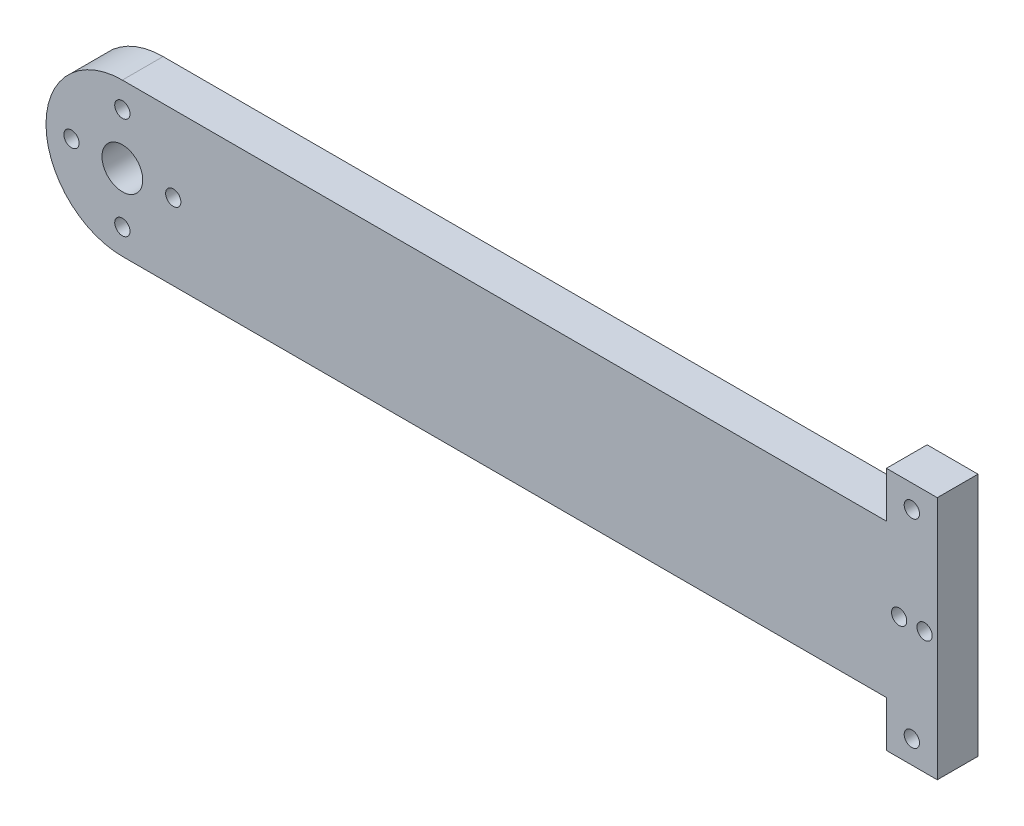
ISO-10303-21;
HEADER;
FILE_DESCRIPTION(('STEP AP214'),'2;1');
FILE_NAME('part.step','',(''),(''),'','','');
FILE_SCHEMA(('AUTOMOTIVE_DESIGN { 1 0 10303 214 1 1 1 1 }'));
ENDSEC;
DATA;
#1=APPLICATION_CONTEXT('core data for automotive mechanical design processes');
#2=APPLICATION_PROTOCOL_DEFINITION('international standard','automotive_design',2000,#1);
#3=PRODUCT_CONTEXT('',#1,'mechanical');
#4=PRODUCT('Part','Part','',(#3));
#5=PRODUCT_RELATED_PRODUCT_CATEGORY('part','',(#4));
#6=PRODUCT_DEFINITION_FORMATION('','',#4);
#7=PRODUCT_DEFINITION_CONTEXT('part definition',#1,'design');
#8=PRODUCT_DEFINITION('design','',#6,#7);
#9=PRODUCT_DEFINITION_SHAPE('','',#8);
#10=(LENGTH_UNIT() NAMED_UNIT(*) SI_UNIT(.MILLI.,.METRE.));
#11=(NAMED_UNIT(*) PLANE_ANGLE_UNIT() SI_UNIT($,.RADIAN.));
#12=(NAMED_UNIT(*) SI_UNIT($,.STERADIAN.) SOLID_ANGLE_UNIT());
#13=UNCERTAINTY_MEASURE_WITH_UNIT(LENGTH_MEASURE(1.E-05),#10,'distance_accuracy_value','');
#14=(GEOMETRIC_REPRESENTATION_CONTEXT(3) GLOBAL_UNCERTAINTY_ASSIGNED_CONTEXT((#13)) GLOBAL_UNIT_ASSIGNED_CONTEXT((#10,
#11,#12)) REPRESENTATION_CONTEXT('',''));
#15=CARTESIAN_POINT('',(0.,0.,0.));
#16=DIRECTION('',(0.,0.,1.));
#17=DIRECTION('',(1.,0.,0.));
#18=AXIS2_PLACEMENT_3D('',#15,#16,#17);
#19=CARTESIAN_POINT('',(0.,-27.2171452130383,8.));
#20=DIRECTION('',(0.,0.,-1.));
#21=DIRECTION('',(-1.,0.,0.));
#22=AXIS2_PLACEMENT_3D('',#19,#20,#21);
#23=CYLINDRICAL_SURFACE('',#22,15.0017483158971);
#24=CARTESIAN_POINT('',(0.,-27.2171452130383,0.));
#25=DIRECTION('',(0.,0.,1.));
#26=DIRECTION('',(1.,0.,0.));
#27=AXIS2_PLACEMENT_3D('',#24,#25,#26);
#28=CIRCLE('',#27,15.0017483158971);
#29=CARTESIAN_POINT('',(0.,-12.2153968971412,0.));
#30=VERTEX_POINT('',#29);
#31=CARTESIAN_POINT('',(0.,-42.2188935289354,0.));
#32=VERTEX_POINT('',#31);
#33=EDGE_CURVE('E141',#30,#32,#28,.T.);
#34=ORIENTED_EDGE('',*,*,#33,.T.);
#35=DIRECTION('',(0.,0.,-1.));
#36=VECTOR('',#35,1.);
#37=CARTESIAN_POINT('',(0.,-42.2188935289354,8.));
#38=LINE('',#37,#36);
#39=CARTESIAN_POINT('',(0.,-42.2188935289354,8.));
#40=VERTEX_POINT('',#39);
#41=EDGE_CURVE('E11',#40,#32,#38,.T.);
#42=ORIENTED_EDGE('',*,*,#41,.F.);
#43=CARTESIAN_POINT('',(0.,-27.2171452130383,8.));
#44=DIRECTION('',(0.,0.,1.));
#45=DIRECTION('',(1.,0.,0.));
#46=AXIS2_PLACEMENT_3D('',#43,#44,#45);
#47=CIRCLE('',#46,15.0017483158971);
#48=CARTESIAN_POINT('',(0.,-12.2153968971412,8.));
#49=VERTEX_POINT('',#48);
#50=EDGE_CURVE('E165',#49,#40,#47,.T.);
#51=ORIENTED_EDGE('',*,*,#50,.F.);
#52=DIRECTION('',(0.,0.,-1.));
#53=VECTOR('',#52,1.);
#54=CARTESIAN_POINT('',(0.,-12.2153968971412,8.));
#55=LINE('',#54,#53);
#56=EDGE_CURVE('E137',#49,#30,#55,.T.);
#57=ORIENTED_EDGE('',*,*,#56,.T.);
#58=EDGE_LOOP('',(#34,#42,#51,#57));
#59=FACE_BOUND('',#58,.T.);
#60=ADVANCED_FACE('F39',(#59),#23,.T.);
#61=CARTESIAN_POINT('',(0.,-42.2188935289354,8.));
#62=DIRECTION('',(0.,1.,0.));
#63=DIRECTION('',(0.,0.,1.));
#64=AXIS2_PLACEMENT_3D('',#61,#62,#63);
#65=PLANE('',#64);
#66=DIRECTION('',(1.,0.,0.));
#67=VECTOR('',#66,1.);
#68=CARTESIAN_POINT('',(0.,-42.2188935289354,0.));
#69=LINE('',#68,#67);
#70=CARTESIAN_POINT('',(150.106998899436,-42.2188935289354,0.));
#71=VERTEX_POINT('',#70);
#72=EDGE_CURVE('E145',#32,#71,#69,.T.);
#73=ORIENTED_EDGE('',*,*,#72,.T.);
#74=DIRECTION('',(0.,0.,-1.));
#75=VECTOR('',#74,1.);
#76=CARTESIAN_POINT('',(150.106998899436,-42.2188935289354,8.));
#77=LINE('',#76,#75);
#78=CARTESIAN_POINT('',(150.106998899436,-42.2188935289354,8.));
#79=VERTEX_POINT('',#78);
#80=EDGE_CURVE('E49',#79,#71,#77,.T.);
#81=ORIENTED_EDGE('',*,*,#80,.F.);
#82=DIRECTION('',(1.,0.,0.));
#83=VECTOR('',#82,1.);
#84=CARTESIAN_POINT('',(0.,-42.2188935289354,8.));
#85=LINE('',#84,#83);
#86=EDGE_CURVE('E101',#40,#79,#85,.T.);
#87=ORIENTED_EDGE('',*,*,#86,.F.);
#88=ORIENTED_EDGE('',*,*,#41,.T.);
#89=EDGE_LOOP('',(#73,#81,#87,#88));
#90=FACE_BOUND('',#89,.T.);
#91=ADVANCED_FACE('F258',(#90),#65,.F.);
#92=CARTESIAN_POINT('',(150.106998899436,-42.2188935289354,8.));
#93=DIRECTION('',(1.,0.,0.));
#94=DIRECTION('',(0.,0.,-1.));
#95=AXIS2_PLACEMENT_3D('',#92,#93,#94);
#96=PLANE('',#95);
#97=DIRECTION('',(0.,-1.,0.));
#98=VECTOR('',#97,1.);
#99=CARTESIAN_POINT('',(150.106998899436,-42.2188935289354,0.));
#100=LINE('',#99,#98);
#101=CARTESIAN_POINT('',(150.106998899436,-51.2231194720718,0.));
#102=VERTEX_POINT('',#101);
#103=EDGE_CURVE('E148',#71,#102,#100,.T.);
#104=ORIENTED_EDGE('',*,*,#103,.T.);
#105=DIRECTION('',(0.,0.,-1.));
#106=VECTOR('',#105,1.);
#107=CARTESIAN_POINT('',(150.106998899436,-51.2231194720718,8.));
#108=LINE('',#107,#106);
#109=CARTESIAN_POINT('',(150.106998899436,-51.2231194720718,8.));
#110=VERTEX_POINT('',#109);
#111=EDGE_CURVE('E176',#110,#102,#108,.T.);
#112=ORIENTED_EDGE('',*,*,#111,.F.);
#113=DIRECTION('',(0.,-1.,0.));
#114=VECTOR('',#113,1.);
#115=CARTESIAN_POINT('',(150.106998899436,-42.2188935289354,8.));
#116=LINE('',#115,#114);
#117=EDGE_CURVE('E421',#79,#110,#116,.T.);
#118=ORIENTED_EDGE('',*,*,#117,.F.);
#119=ORIENTED_EDGE('',*,*,#80,.T.);
#120=EDGE_LOOP('',(#104,#112,#118,#119));
#121=FACE_BOUND('',#120,.T.);
#122=ADVANCED_FACE('F262',(#121),#96,.F.);
#123=CARTESIAN_POINT('',(155.102889250726,-51.2231194720718,8.));
#124=DIRECTION('',(0.,1.,0.));
#125=DIRECTION('',(0.,0.,1.));
#126=AXIS2_PLACEMENT_3D('',#123,#124,#125);
#127=PLANE('',#126);
#128=DIRECTION('',(1.,0.,0.));
#129=VECTOR('',#128,1.);
#130=CARTESIAN_POINT('',(155.102889250726,-51.2231194720718,0.));
#131=LINE('',#130,#129);
#132=CARTESIAN_POINT('',(160.100118241478,-51.2231194720718,0.));
#133=VERTEX_POINT('',#132);
#134=EDGE_CURVE('E152',#102,#133,#131,.T.);
#135=ORIENTED_EDGE('',*,*,#134,.T.);
#136=DIRECTION('',(0.,0.,-1.));
#137=VECTOR('',#136,1.);
#138=CARTESIAN_POINT('',(160.100118241478,-51.2231194720718,8.));
#139=LINE('',#138,#137);
#140=CARTESIAN_POINT('',(160.100118241478,-51.2231194720718,8.));
#141=VERTEX_POINT('',#140);
#142=EDGE_CURVE('E172',#141,#133,#139,.T.);
#143=ORIENTED_EDGE('',*,*,#142,.F.);
#144=DIRECTION('',(1.,0.,0.));
#145=VECTOR('',#144,1.);
#146=CARTESIAN_POINT('',(150.106998899436,-51.2231194720718,8.));
#147=LINE('',#146,#145);
#148=EDGE_CURVE('E424',#110,#141,#147,.T.);
#149=ORIENTED_EDGE('',*,*,#148,.F.);
#150=ORIENTED_EDGE('',*,*,#111,.T.);
#151=EDGE_LOOP('',(#135,#143,#149,#150));
#152=FACE_BOUND('',#151,.T.);
#153=ADVANCED_FACE('F266',(#152),#127,.F.);
#154=CARTESIAN_POINT('',(160.100118241478,-3.21468009879723,8.));
#155=DIRECTION('',(-1.,0.,0.));
#156=DIRECTION('',(0.,0.,1.));
#157=AXIS2_PLACEMENT_3D('',#154,#155,#156);
#158=PLANE('',#157);
#159=DIRECTION('',(0.,1.,0.));
#160=VECTOR('',#159,1.);
#161=CARTESIAN_POINT('',(160.100118241478,-3.21468009879723,0.));
#162=LINE('',#161,#160);
#163=CARTESIAN_POINT('',(160.100118241478,-3.21468009879723,0.));
#164=VERTEX_POINT('',#163);
#165=EDGE_CURVE('E155',#133,#164,#162,.T.);
#166=ORIENTED_EDGE('',*,*,#165,.T.);
#167=DIRECTION('',(0.,0.,-1.));
#168=VECTOR('',#167,1.);
#169=CARTESIAN_POINT('',(160.100118241478,-3.21468009879723,8.));
#170=LINE('',#169,#168);
#171=CARTESIAN_POINT('',(160.100118241478,-3.21468009879723,8.));
#172=VERTEX_POINT('',#171);
#173=EDGE_CURVE('E130',#172,#164,#170,.T.);
#174=ORIENTED_EDGE('',*,*,#173,.F.);
#175=DIRECTION('',(0.,1.,0.));
#176=VECTOR('',#175,1.);
#177=CARTESIAN_POINT('',(160.100118241478,-3.21468009879723,8.));
#178=LINE('',#177,#176);
#179=EDGE_CURVE('E120',#141,#172,#178,.T.);
#180=ORIENTED_EDGE('',*,*,#179,.F.);
#181=ORIENTED_EDGE('',*,*,#142,.T.);
#182=EDGE_LOOP('',(#166,#174,#180,#181));
#183=FACE_BOUND('',#182,.T.);
#184=ADVANCED_FACE('F272',(#183),#158,.F.);
#185=CARTESIAN_POINT('',(150.106998899436,-3.21468009879723,8.));
#186=DIRECTION('',(0.,-1.,0.));
#187=DIRECTION('',(0.,0.,-1.));
#188=AXIS2_PLACEMENT_3D('',#185,#186,#187);
#189=PLANE('',#188);
#190=DIRECTION('',(-1.,0.,0.));
#191=VECTOR('',#190,1.);
#192=CARTESIAN_POINT('',(150.106998899436,-3.21468009879723,0.));
#193=LINE('',#192,#191);
#194=CARTESIAN_POINT('',(150.106998899436,-3.21468009879723,0.));
#195=VERTEX_POINT('',#194);
#196=EDGE_CURVE('E128',#164,#195,#193,.T.);
#197=ORIENTED_EDGE('',*,*,#196,.T.);
#198=DIRECTION('',(0.,0.,-1.));
#199=VECTOR('',#198,1.);
#200=CARTESIAN_POINT('',(150.106998899436,-3.21468009879723,8.));
#201=LINE('',#200,#199);
#202=CARTESIAN_POINT('',(150.106998899436,-3.21468009879723,8.));
#203=VERTEX_POINT('',#202);
#204=EDGE_CURVE('E126',#203,#195,#201,.T.);
#205=ORIENTED_EDGE('',*,*,#204,.F.);
#206=DIRECTION('',(-1.,0.,0.));
#207=VECTOR('',#206,1.);
#208=CARTESIAN_POINT('',(155.102889250726,-3.21468009879723,8.));
#209=LINE('',#208,#207);
#210=EDGE_CURVE('E114',#172,#203,#209,.T.);
#211=ORIENTED_EDGE('',*,*,#210,.F.);
#212=ORIENTED_EDGE('',*,*,#173,.T.);
#213=EDGE_LOOP('',(#197,#205,#211,#212));
#214=FACE_BOUND('',#213,.T.);
#215=ADVANCED_FACE('F127',(#214),#189,.F.);
#216=CARTESIAN_POINT('',(150.106998899436,-12.2153968971412,8.));
#217=DIRECTION('',(1.,0.,0.));
#218=DIRECTION('',(0.,0.,-1.));
#219=AXIS2_PLACEMENT_3D('',#216,#217,#218);
#220=PLANE('',#219);
#221=DIRECTION('',(0.,-1.,0.));
#222=VECTOR('',#221,1.);
#223=CARTESIAN_POINT('',(150.106998899436,-12.2153968971412,0.));
#224=LINE('',#223,#222);
#225=CARTESIAN_POINT('',(150.106998899436,-12.2153968971412,0.));
#226=VERTEX_POINT('',#225);
#227=EDGE_CURVE('E87',#195,#226,#224,.T.);
#228=ORIENTED_EDGE('',*,*,#227,.T.);
#229=DIRECTION('',(0.,0.,-1.));
#230=VECTOR('',#229,1.);
#231=CARTESIAN_POINT('',(150.106998899436,-12.2153968971412,8.));
#232=LINE('',#231,#230);
#233=CARTESIAN_POINT('',(150.106998899436,-12.2153968971412,8.));
#234=VERTEX_POINT('',#233);
#235=EDGE_CURVE('E131',#234,#226,#232,.T.);
#236=ORIENTED_EDGE('',*,*,#235,.F.);
#237=DIRECTION('',(0.,-1.,0.));
#238=VECTOR('',#237,1.);
#239=CARTESIAN_POINT('',(150.106998899436,-12.2153968971412,8.));
#240=LINE('',#239,#238);
#241=EDGE_CURVE('E118',#203,#234,#240,.T.);
#242=ORIENTED_EDGE('',*,*,#241,.F.);
#243=ORIENTED_EDGE('',*,*,#204,.T.);
#244=EDGE_LOOP('',(#228,#236,#242,#243));
#245=FACE_BOUND('',#244,.T.);
#246=ADVANCED_FACE('F133',(#245),#220,.F.);
#247=CARTESIAN_POINT('',(0.,-12.2153968971412,8.));
#248=DIRECTION('',(0.,-1.,0.));
#249=DIRECTION('',(0.,0.,-1.));
#250=AXIS2_PLACEMENT_3D('',#247,#248,#249);
#251=PLANE('',#250);
#252=DIRECTION('',(-1.,0.,0.));
#253=VECTOR('',#252,1.);
#254=CARTESIAN_POINT('',(0.,-12.2153968971412,0.));
#255=LINE('',#254,#253);
#256=EDGE_CURVE('E93',#226,#30,#255,.T.);
#257=ORIENTED_EDGE('',*,*,#256,.T.);
#258=ORIENTED_EDGE('',*,*,#56,.F.);
#259=DIRECTION('',(-1.,0.,0.));
#260=VECTOR('',#259,1.);
#261=CARTESIAN_POINT('',(0.,-12.2153968971412,8.));
#262=LINE('',#261,#260);
#263=EDGE_CURVE('E58',#234,#49,#262,.T.);
#264=ORIENTED_EDGE('',*,*,#263,.F.);
#265=ORIENTED_EDGE('',*,*,#235,.T.);
#266=EDGE_LOOP('',(#257,#258,#264,#265));
#267=FACE_BOUND('',#266,.T.);
#268=ADVANCED_FACE('F247',(#267),#251,.F.);
#269=CARTESIAN_POINT('',(0.,-27.2171452130383,8.));
#270=DIRECTION('',(0.,0.,1.));
#271=DIRECTION('',(1.,0.,0.));
#272=AXIS2_PLACEMENT_3D('',#269,#270,#271);
#273=PLANE('',#272);
#274=CARTESIAN_POINT('',(155.102889250726,-46.7210065005036,8.));
#275=DIRECTION('',(0.,0.,1.));
#276=DIRECTION('',(1.,0.,0.));
#277=AXIS2_PLACEMENT_3D('',#274,#275,#276);
#278=CIRCLE('',#277,1.50444949285966);
#279=CARTESIAN_POINT('',(156.607338743585,-46.7210065005036,8.));
#280=VERTEX_POINT('',#279);
#281=EDGE_CURVE('E396',#280,#280,#278,.T.);
#282=ORIENTED_EDGE('',*,*,#281,.F.);
#283=EDGE_LOOP('',(#282));
#284=FACE_BOUND('',#283,.T.);
#285=CARTESIAN_POINT('',(155.102889250726,-7.7150384979692,8.));
#286=DIRECTION('',(0.,0.,1.));
#287=DIRECTION('',(1.,0.,0.));
#288=AXIS2_PLACEMENT_3D('',#285,#286,#287);
#289=CIRCLE('',#288,1.50369477585795);
#290=CARTESIAN_POINT('',(156.606584026584,-7.7150384979692,8.));
#291=VERTEX_POINT('',#290);
#292=EDGE_CURVE('E399',#291,#291,#289,.T.);
#293=ORIENTED_EDGE('',*,*,#292,.F.);
#294=EDGE_LOOP('',(#293));
#295=FACE_BOUND('',#294,.T.);
#296=CARTESIAN_POINT('',(152.604944075081,-27.2171452130383,8.));
#297=DIRECTION('',(0.,0.,1.));
#298=DIRECTION('',(1.,0.,0.));
#299=AXIS2_PLACEMENT_3D('',#296,#297,#298);
#300=CIRCLE('',#299,1.49537102500933);
#301=CARTESIAN_POINT('',(154.10031510009,-27.2171452130383,8.));
#302=VERTEX_POINT('',#301);
#303=EDGE_CURVE('E407',#302,#302,#300,.T.);
#304=ORIENTED_EDGE('',*,*,#303,.F.);
#305=EDGE_LOOP('',(#304));
#306=FACE_BOUND('',#305,.T.);
#307=CARTESIAN_POINT('',(157.601503746102,-27.2171452130383,8.));
#308=DIRECTION('',(0.,0.,1.));
#309=DIRECTION('',(1.,0.,0.));
#310=AXIS2_PLACEMENT_3D('',#307,#308,#309);
#311=CIRCLE('',#310,1.4974909142542);
#312=CARTESIAN_POINT('',(159.098994660356,-27.2171452130383,8.));
#313=VERTEX_POINT('',#312);
#314=EDGE_CURVE('E410',#313,#313,#311,.T.);
#315=ORIENTED_EDGE('',*,*,#314,.F.);
#316=EDGE_LOOP('',(#315));
#317=FACE_BOUND('',#316,.T.);
#318=CARTESIAN_POINT('',(0.,-27.2171452130383,8.));
#319=DIRECTION('',(0.,0.,1.));
#320=DIRECTION('',(1.,0.,0.));
#321=AXIS2_PLACEMENT_3D('',#318,#319,#320);
#322=CIRCLE('',#321,4.00484826719098);
#323=CARTESIAN_POINT('',(4.00484826719098,-27.2171452130383,8.));
#324=VERTEX_POINT('',#323);
#325=EDGE_CURVE('E416',#324,#324,#322,.T.);
#326=ORIENTED_EDGE('',*,*,#325,.F.);
#327=EDGE_LOOP('',(#326));
#328=FACE_BOUND('',#327,.T.);
#329=CARTESIAN_POINT('',(0.,-17.219491861017,8.));
#330=DIRECTION('',(0.,0.,1.));
#331=DIRECTION('',(1.,0.,0.));
#332=AXIS2_PLACEMENT_3D('',#329,#330,#331);
#333=CIRCLE('',#332,1.50288444883312);
#334=CARTESIAN_POINT('',(1.50288444883312,-17.219491861017,8.));
#335=VERTEX_POINT('',#334);
#336=EDGE_CURVE('E435',#335,#335,#333,.T.);
#337=ORIENTED_EDGE('',*,*,#336,.F.);
#338=EDGE_LOOP('',(#337));
#339=FACE_BOUND('',#338,.T.);
#340=CARTESIAN_POINT('',(9.99660548119298,-27.2171452130383,8.));
#341=DIRECTION('',(0.,0.,1.));
#342=DIRECTION('',(1.,0.,0.));
#343=AXIS2_PLACEMENT_3D('',#340,#341,#342);
#344=CIRCLE('',#343,1.49545373303539);
#345=CARTESIAN_POINT('',(11.4920592142284,-27.2171452130383,8.));
#346=VERTEX_POINT('',#345);
#347=EDGE_CURVE('E404',#346,#346,#344,.T.);
#348=ORIENTED_EDGE('',*,*,#347,.F.);
#349=EDGE_LOOP('',(#348));
#350=FACE_BOUND('',#349,.T.);
#351=CARTESIAN_POINT('',(-9.99587870751029,-27.2171452130383,8.));
#352=DIRECTION('',(0.,0.,1.));
#353=DIRECTION('',(1.,0.,0.));
#354=AXIS2_PLACEMENT_3D('',#351,#352,#353);
#355=CIRCLE('',#354,1.50149985217059);
#356=CARTESIAN_POINT('',(-8.4943788553397,-27.2171452130383,8.));
#357=VERTEX_POINT('',#356);
#358=EDGE_CURVE('E398',#357,#357,#355,.T.);
#359=ORIENTED_EDGE('',*,*,#358,.F.);
#360=EDGE_LOOP('',(#359));
#361=FACE_BOUND('',#360,.T.);
#362=CARTESIAN_POINT('',(0.,-37.2139919983513,8.));
#363=DIRECTION('',(0.,0.,1.));
#364=DIRECTION('',(1.,0.,0.));
#365=AXIS2_PLACEMENT_3D('',#362,#363,#364);
#366=CIRCLE('',#365,1.50074061914927);
#367=CARTESIAN_POINT('',(1.50074061914927,-37.2139919983513,8.));
#368=VERTEX_POINT('',#367);
#369=EDGE_CURVE('E188',#368,#368,#366,.T.);
#370=ORIENTED_EDGE('',*,*,#369,.F.);
#371=EDGE_LOOP('',(#370));
#372=FACE_BOUND('',#371,.T.);
#373=ORIENTED_EDGE('',*,*,#50,.T.);
#374=ORIENTED_EDGE('',*,*,#86,.T.);
#375=ORIENTED_EDGE('',*,*,#117,.T.);
#376=ORIENTED_EDGE('',*,*,#148,.T.);
#377=ORIENTED_EDGE('',*,*,#179,.T.);
#378=ORIENTED_EDGE('',*,*,#210,.T.);
#379=ORIENTED_EDGE('',*,*,#241,.T.);
#380=ORIENTED_EDGE('',*,*,#263,.T.);
#381=EDGE_LOOP('',(#373,#374,#375,#376,#377,#378,#379,#380));
#382=FACE_BOUND('',#381,.T.);
#383=ADVANCED_FACE('F116',(#284,#295,#306,#317,#328,#339,#350,#361,#372,#382),#273,.T.);
#384=CARTESIAN_POINT('',(0.,-27.2171452130383,0.));
#385=DIRECTION('',(0.,0.,1.));
#386=DIRECTION('',(1.,0.,0.));
#387=AXIS2_PLACEMENT_3D('',#384,#385,#386);
#388=PLANE('',#387);
#389=CARTESIAN_POINT('',(155.102889250726,-46.7210065005036,0.));
#390=DIRECTION('',(0.,0.,1.));
#391=DIRECTION('',(1.,0.,0.));
#392=AXIS2_PLACEMENT_3D('',#389,#390,#391);
#393=CIRCLE('',#392,1.50444949285966);
#394=CARTESIAN_POINT('',(156.607338743585,-46.7210065005036,0.));
#395=VERTEX_POINT('',#394);
#396=EDGE_CURVE('E42',#395,#395,#393,.F.);
#397=ORIENTED_EDGE('',*,*,#396,.F.);
#398=EDGE_LOOP('',(#397));
#399=FACE_BOUND('',#398,.T.);
#400=CARTESIAN_POINT('',(155.102889250726,-7.7150384979692,0.));
#401=DIRECTION('',(0.,0.,1.));
#402=DIRECTION('',(1.,0.,0.));
#403=AXIS2_PLACEMENT_3D('',#400,#401,#402);
#404=CIRCLE('',#403,1.50369477585795);
#405=CARTESIAN_POINT('',(156.606584026584,-7.7150384979692,0.));
#406=VERTEX_POINT('',#405);
#407=EDGE_CURVE('E211',#406,#406,#404,.F.);
#408=ORIENTED_EDGE('',*,*,#407,.F.);
#409=EDGE_LOOP('',(#408));
#410=FACE_BOUND('',#409,.T.);
#411=CARTESIAN_POINT('',(152.604944075081,-27.2171452130383,0.));
#412=DIRECTION('',(0.,0.,1.));
#413=DIRECTION('',(1.,0.,0.));
#414=AXIS2_PLACEMENT_3D('',#411,#412,#413);
#415=CIRCLE('',#414,1.49537102500933);
#416=CARTESIAN_POINT('',(154.10031510009,-27.2171452130383,0.));
#417=VERTEX_POINT('',#416);
#418=EDGE_CURVE('E208',#417,#417,#415,.F.);
#419=ORIENTED_EDGE('',*,*,#418,.F.);
#420=EDGE_LOOP('',(#419));
#421=FACE_BOUND('',#420,.T.);
#422=CARTESIAN_POINT('',(157.601503746102,-27.2171452130383,0.));
#423=DIRECTION('',(0.,0.,1.));
#424=DIRECTION('',(1.,0.,0.));
#425=AXIS2_PLACEMENT_3D('',#422,#423,#424);
#426=CIRCLE('',#425,1.4974909142542);
#427=CARTESIAN_POINT('',(159.098994660356,-27.2171452130383,0.));
#428=VERTEX_POINT('',#427);
#429=EDGE_CURVE('E204',#428,#428,#426,.F.);
#430=ORIENTED_EDGE('',*,*,#429,.F.);
#431=EDGE_LOOP('',(#430));
#432=FACE_BOUND('',#431,.T.);
#433=CARTESIAN_POINT('',(0.,-27.2171452130383,0.));
#434=DIRECTION('',(0.,0.,1.));
#435=DIRECTION('',(1.,0.,0.));
#436=AXIS2_PLACEMENT_3D('',#433,#434,#435);
#437=CIRCLE('',#436,4.00484826719098);
#438=CARTESIAN_POINT('',(4.00484826719098,-27.2171452130383,0.));
#439=VERTEX_POINT('',#438);
#440=EDGE_CURVE('E200',#439,#439,#437,.F.);
#441=ORIENTED_EDGE('',*,*,#440,.F.);
#442=EDGE_LOOP('',(#441));
#443=FACE_BOUND('',#442,.T.);
#444=CARTESIAN_POINT('',(0.,-17.219491861017,0.));
#445=DIRECTION('',(0.,0.,1.));
#446=DIRECTION('',(1.,0.,0.));
#447=AXIS2_PLACEMENT_3D('',#444,#445,#446);
#448=CIRCLE('',#447,1.50288444883312);
#449=CARTESIAN_POINT('',(1.50288444883312,-17.219491861017,0.));
#450=VERTEX_POINT('',#449);
#451=EDGE_CURVE('E196',#450,#450,#448,.F.);
#452=ORIENTED_EDGE('',*,*,#451,.F.);
#453=EDGE_LOOP('',(#452));
#454=FACE_BOUND('',#453,.T.);
#455=CARTESIAN_POINT('',(9.99660548119298,-27.2171452130383,0.));
#456=DIRECTION('',(0.,0.,1.));
#457=DIRECTION('',(1.,0.,0.));
#458=AXIS2_PLACEMENT_3D('',#455,#456,#457);
#459=CIRCLE('',#458,1.49545373303539);
#460=CARTESIAN_POINT('',(11.4920592142284,-27.2171452130383,0.));
#461=VERTEX_POINT('',#460);
#462=EDGE_CURVE('E192',#461,#461,#459,.F.);
#463=ORIENTED_EDGE('',*,*,#462,.F.);
#464=EDGE_LOOP('',(#463));
#465=FACE_BOUND('',#464,.T.);
#466=CARTESIAN_POINT('',(-9.99587870751029,-27.2171452130383,0.));
#467=DIRECTION('',(0.,0.,1.));
#468=DIRECTION('',(1.,0.,0.));
#469=AXIS2_PLACEMENT_3D('',#466,#467,#468);
#470=CIRCLE('',#469,1.50149985217059);
#471=CARTESIAN_POINT('',(-8.4943788553397,-27.2171452130383,0.));
#472=VERTEX_POINT('',#471);
#473=EDGE_CURVE('E187',#472,#472,#470,.F.);
#474=ORIENTED_EDGE('',*,*,#473,.F.);
#475=EDGE_LOOP('',(#474));
#476=FACE_BOUND('',#475,.T.);
#477=CARTESIAN_POINT('',(0.,-37.2139919983513,0.));
#478=DIRECTION('',(0.,0.,1.));
#479=DIRECTION('',(1.,0.,0.));
#480=AXIS2_PLACEMENT_3D('',#477,#478,#479);
#481=CIRCLE('',#480,1.50074061914927);
#482=CARTESIAN_POINT('',(1.50074061914927,-37.2139919983513,0.));
#483=VERTEX_POINT('',#482);
#484=EDGE_CURVE('E183',#483,#483,#481,.F.);
#485=ORIENTED_EDGE('',*,*,#484,.F.);
#486=EDGE_LOOP('',(#485));
#487=FACE_BOUND('',#486,.T.);
#488=ORIENTED_EDGE('',*,*,#33,.F.);
#489=ORIENTED_EDGE('',*,*,#256,.F.);
#490=ORIENTED_EDGE('',*,*,#227,.F.);
#491=ORIENTED_EDGE('',*,*,#196,.F.);
#492=ORIENTED_EDGE('',*,*,#165,.F.);
#493=ORIENTED_EDGE('',*,*,#134,.F.);
#494=ORIENTED_EDGE('',*,*,#103,.F.);
#495=ORIENTED_EDGE('',*,*,#72,.F.);
#496=EDGE_LOOP('',(#488,#489,#490,#491,#492,#493,#494,#495));
#497=FACE_BOUND('',#496,.T.);
#498=ADVANCED_FACE('F222',(#399,#410,#421,#432,#443,#454,#465,#476,#487,#497),#388,.F.);
#499=CARTESIAN_POINT('',(0.,-37.2139919983513,8.));
#500=DIRECTION('',(0.,0.,-1.));
#501=DIRECTION('',(-1.,0.,0.));
#502=AXIS2_PLACEMENT_3D('',#499,#500,#501);
#503=CYLINDRICAL_SURFACE('',#502,1.50074061914927);
#504=ORIENTED_EDGE('',*,*,#369,.T.);
#505=EDGE_LOOP('',(#504));
#506=FACE_BOUND('',#505,.T.);
#507=ORIENTED_EDGE('',*,*,#484,.T.);
#508=EDGE_LOOP('',(#507));
#509=FACE_BOUND('',#508,.T.);
#510=ADVANCED_FACE('F225',(#506,#509),#503,.F.);
#511=CARTESIAN_POINT('',(-9.99587870751029,-27.2171452130383,8.));
#512=DIRECTION('',(0.,0.,-1.));
#513=DIRECTION('',(-1.,0.,0.));
#514=AXIS2_PLACEMENT_3D('',#511,#512,#513);
#515=CYLINDRICAL_SURFACE('',#514,1.50149985217059);
#516=ORIENTED_EDGE('',*,*,#358,.T.);
#517=EDGE_LOOP('',(#516));
#518=FACE_BOUND('',#517,.T.);
#519=ORIENTED_EDGE('',*,*,#473,.T.);
#520=EDGE_LOOP('',(#519));
#521=FACE_BOUND('',#520,.T.);
#522=ADVANCED_FACE('F311',(#518,#521),#515,.F.);
#523=CARTESIAN_POINT('',(9.99660548119298,-27.2171452130383,8.));
#524=DIRECTION('',(0.,0.,-1.));
#525=DIRECTION('',(-1.,0.,0.));
#526=AXIS2_PLACEMENT_3D('',#523,#524,#525);
#527=CYLINDRICAL_SURFACE('',#526,1.49545373303539);
#528=ORIENTED_EDGE('',*,*,#347,.T.);
#529=EDGE_LOOP('',(#528));
#530=FACE_BOUND('',#529,.T.);
#531=ORIENTED_EDGE('',*,*,#462,.T.);
#532=EDGE_LOOP('',(#531));
#533=FACE_BOUND('',#532,.T.);
#534=ADVANCED_FACE('F321',(#530,#533),#527,.F.);
#535=CARTESIAN_POINT('',(0.,-17.219491861017,8.));
#536=DIRECTION('',(0.,0.,-1.));
#537=DIRECTION('',(-1.,0.,0.));
#538=AXIS2_PLACEMENT_3D('',#535,#536,#537);
#539=CYLINDRICAL_SURFACE('',#538,1.50288444883312);
#540=ORIENTED_EDGE('',*,*,#336,.T.);
#541=EDGE_LOOP('',(#540));
#542=FACE_BOUND('',#541,.T.);
#543=ORIENTED_EDGE('',*,*,#451,.T.);
#544=EDGE_LOOP('',(#543));
#545=FACE_BOUND('',#544,.T.);
#546=ADVANCED_FACE('F331',(#542,#545),#539,.F.);
#547=CARTESIAN_POINT('',(0.,-27.2171452130383,8.));
#548=DIRECTION('',(0.,0.,-1.));
#549=DIRECTION('',(-1.,0.,0.));
#550=AXIS2_PLACEMENT_3D('',#547,#548,#549);
#551=CYLINDRICAL_SURFACE('',#550,4.00484826719098);
#552=ORIENTED_EDGE('',*,*,#325,.T.);
#553=EDGE_LOOP('',(#552));
#554=FACE_BOUND('',#553,.T.);
#555=ORIENTED_EDGE('',*,*,#440,.T.);
#556=EDGE_LOOP('',(#555));
#557=FACE_BOUND('',#556,.T.);
#558=ADVANCED_FACE('F341',(#554,#557),#551,.F.);
#559=CARTESIAN_POINT('',(157.601503746102,-27.2171452130383,8.));
#560=DIRECTION('',(0.,0.,-1.));
#561=DIRECTION('',(-1.,0.,0.));
#562=AXIS2_PLACEMENT_3D('',#559,#560,#561);
#563=CYLINDRICAL_SURFACE('',#562,1.4974909142542);
#564=ORIENTED_EDGE('',*,*,#314,.T.);
#565=EDGE_LOOP('',(#564));
#566=FACE_BOUND('',#565,.T.);
#567=ORIENTED_EDGE('',*,*,#429,.T.);
#568=EDGE_LOOP('',(#567));
#569=FACE_BOUND('',#568,.T.);
#570=ADVANCED_FACE('F351',(#566,#569),#563,.F.);
#571=CARTESIAN_POINT('',(152.604944075081,-27.2171452130383,8.));
#572=DIRECTION('',(0.,0.,-1.));
#573=DIRECTION('',(-1.,0.,0.));
#574=AXIS2_PLACEMENT_3D('',#571,#572,#573);
#575=CYLINDRICAL_SURFACE('',#574,1.49537102500933);
#576=ORIENTED_EDGE('',*,*,#303,.T.);
#577=EDGE_LOOP('',(#576));
#578=FACE_BOUND('',#577,.T.);
#579=ORIENTED_EDGE('',*,*,#418,.T.);
#580=EDGE_LOOP('',(#579));
#581=FACE_BOUND('',#580,.T.);
#582=ADVANCED_FACE('F361',(#578,#581),#575,.F.);
#583=CARTESIAN_POINT('',(155.102889250726,-7.7150384979692,8.));
#584=DIRECTION('',(0.,0.,-1.));
#585=DIRECTION('',(-1.,0.,0.));
#586=AXIS2_PLACEMENT_3D('',#583,#584,#585);
#587=CYLINDRICAL_SURFACE('',#586,1.50369477585795);
#588=ORIENTED_EDGE('',*,*,#292,.T.);
#589=EDGE_LOOP('',(#588));
#590=FACE_BOUND('',#589,.T.);
#591=ORIENTED_EDGE('',*,*,#407,.T.);
#592=EDGE_LOOP('',(#591));
#593=FACE_BOUND('',#592,.T.);
#594=ADVANCED_FACE('F371',(#590,#593),#587,.F.);
#595=CARTESIAN_POINT('',(155.102889250726,-46.7210065005036,8.));
#596=DIRECTION('',(0.,0.,-1.));
#597=DIRECTION('',(-1.,0.,0.));
#598=AXIS2_PLACEMENT_3D('',#595,#596,#597);
#599=CYLINDRICAL_SURFACE('',#598,1.50444949285966);
#600=ORIENTED_EDGE('',*,*,#281,.T.);
#601=EDGE_LOOP('',(#600));
#602=FACE_BOUND('',#601,.T.);
#603=ORIENTED_EDGE('',*,*,#396,.T.);
#604=EDGE_LOOP('',(#603));
#605=FACE_BOUND('',#604,.T.);
#606=ADVANCED_FACE('F220',(#602,#605),#599,.F.);
#607=CLOSED_SHELL('',(#60,#91,#122,#153,#184,#215,#246,#268,#383,#498,#510,#522,#534,#546,#558,
#570,#582,#594,#606));
#608=MANIFOLD_SOLID_BREP('B2',#607);
#609=ADVANCED_BREP_SHAPE_REPRESENTATION('',(#18,#608),#14);
#610=SHAPE_DEFINITION_REPRESENTATION(#9,#609);
ENDSEC;
END-ISO-10303-21;
